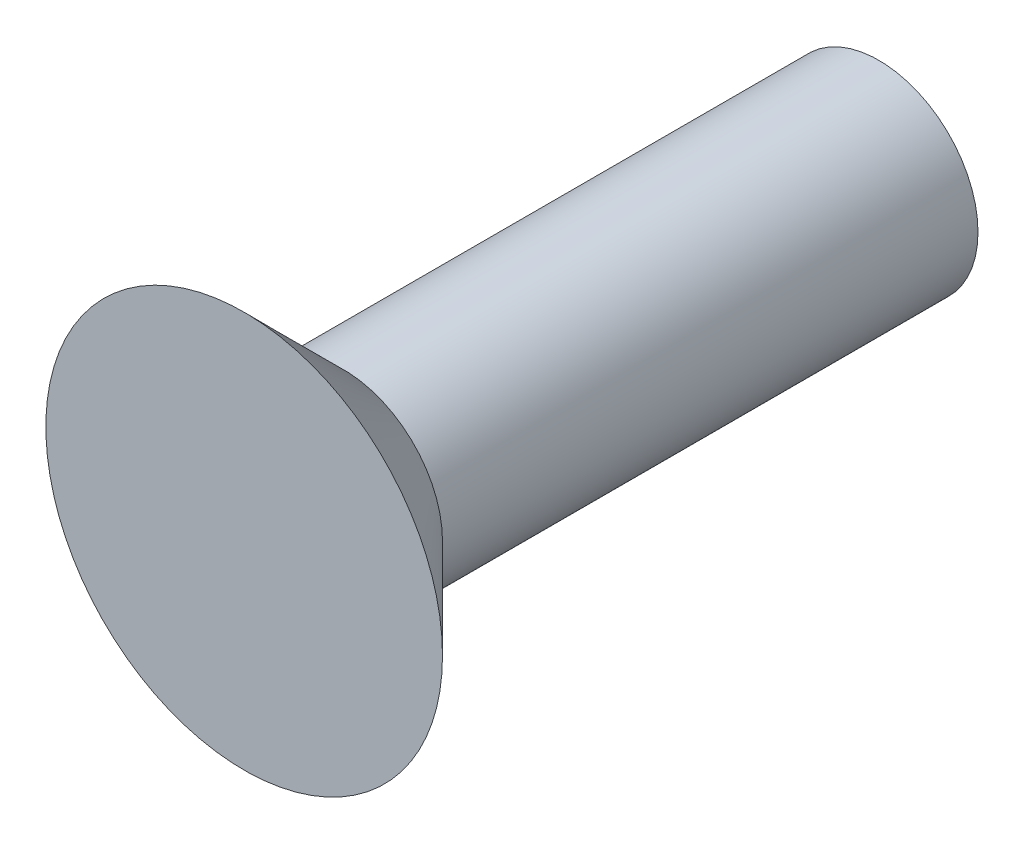
ISO-10303-21;
HEADER;
FILE_DESCRIPTION(('STEP AP214'),'2;1');
FILE_NAME('part.step','',(''),(''),'','','');
FILE_SCHEMA(('AUTOMOTIVE_DESIGN { 1 0 10303 214 1 1 1 1 }'));
ENDSEC;
DATA;
#1=APPLICATION_CONTEXT('core data for automotive mechanical design processes');
#2=APPLICATION_PROTOCOL_DEFINITION('international standard','automotive_design',2000,#1);
#3=PRODUCT_CONTEXT('',#1,'mechanical');
#4=PRODUCT('Part','Part','',(#3));
#5=PRODUCT_RELATED_PRODUCT_CATEGORY('part','',(#4));
#6=PRODUCT_DEFINITION_FORMATION('','',#4);
#7=PRODUCT_DEFINITION_CONTEXT('part definition',#1,'design');
#8=PRODUCT_DEFINITION('design','',#6,#7);
#9=PRODUCT_DEFINITION_SHAPE('','',#8);
#10=(LENGTH_UNIT() NAMED_UNIT(*) SI_UNIT(.MILLI.,.METRE.));
#11=(NAMED_UNIT(*) PLANE_ANGLE_UNIT() SI_UNIT($,.RADIAN.));
#12=(NAMED_UNIT(*) SI_UNIT($,.STERADIAN.) SOLID_ANGLE_UNIT());
#13=UNCERTAINTY_MEASURE_WITH_UNIT(LENGTH_MEASURE(1.E-05),#10,'distance_accuracy_value','');
#14=(GEOMETRIC_REPRESENTATION_CONTEXT(3) GLOBAL_UNCERTAINTY_ASSIGNED_CONTEXT((#13)) GLOBAL_UNIT_ASSIGNED_CONTEXT((#10,
#11,#12)) REPRESENTATION_CONTEXT('',''));
#15=CARTESIAN_POINT('',(0.,0.,0.));
#16=DIRECTION('',(0.,0.,1.));
#17=DIRECTION('',(1.,0.,0.));
#18=AXIS2_PLACEMENT_3D('',#15,#16,#17);
#19=CARTESIAN_POINT('',(0.,0.,0.));
#20=DIRECTION('',(0.,0.,1.));
#21=DIRECTION('',(1.,0.,0.));
#22=AXIS2_PLACEMENT_3D('',#19,#20,#21);
#23=CONICAL_SURFACE('',#22,2.5,0.785398163397448);
#24=CARTESIAN_POINT('',(0.,0.,-1.25));
#25=DIRECTION('',(0.,0.,1.));
#26=DIRECTION('',(1.,0.,0.));
#27=AXIS2_PLACEMENT_3D('',#24,#25,#26);
#28=CIRCLE('',#27,1.25);
#29=CARTESIAN_POINT('',(1.25,0.,-1.25));
#30=VERTEX_POINT('',#29);
#31=EDGE_CURVE('E43',#30,#30,#28,.T.);
#32=ORIENTED_EDGE('',*,*,#31,.T.);
#33=EDGE_LOOP('',(#32));
#34=FACE_BOUND('',#33,.T.);
#35=CARTESIAN_POINT('',(0.,0.,0.));
#36=DIRECTION('',(0.,0.,1.));
#37=DIRECTION('',(1.,0.,0.));
#38=AXIS2_PLACEMENT_3D('',#35,#36,#37);
#39=CIRCLE('',#38,2.5);
#40=CARTESIAN_POINT('',(2.5,0.,0.));
#41=VERTEX_POINT('',#40);
#42=EDGE_CURVE('E10',#41,#41,#39,.T.);
#43=ORIENTED_EDGE('',*,*,#42,.F.);
#44=EDGE_LOOP('',(#43));
#45=FACE_BOUND('',#44,.T.);
#46=ADVANCED_FACE('F40',(#34,#45),#23,.T.);
#47=CARTESIAN_POINT('',(0.,0.,0.));
#48=DIRECTION('',(0.,0.,1.));
#49=DIRECTION('',(1.,0.,0.));
#50=AXIS2_PLACEMENT_3D('',#47,#48,#49);
#51=PLANE('',#50);
#52=ORIENTED_EDGE('',*,*,#42,.T.);
#53=EDGE_LOOP('',(#52));
#54=FACE_BOUND('',#53,.T.);
#55=ADVANCED_FACE('F65',(#54),#51,.T.);
#56=CARTESIAN_POINT('',(0.,0.,-1.25));
#57=DIRECTION('',(0.,0.,-1.));
#58=DIRECTION('',(-1.,0.,0.));
#59=AXIS2_PLACEMENT_3D('',#56,#57,#58);
#60=CYLINDRICAL_SURFACE('',#59,1.25);
#61=ORIENTED_EDGE('',*,*,#31,.F.);
#62=EDGE_LOOP('',(#61));
#63=FACE_BOUND('',#62,.T.);
#64=CARTESIAN_POINT('',(0.,0.,-8.));
#65=DIRECTION('',(0.,0.,1.));
#66=DIRECTION('',(1.,0.,0.));
#67=AXIS2_PLACEMENT_3D('',#64,#65,#66);
#68=CIRCLE('',#67,1.25);
#69=CARTESIAN_POINT('',(1.25,0.,-8.));
#70=VERTEX_POINT('',#69);
#71=EDGE_CURVE('E50',#70,#70,#68,.T.);
#72=ORIENTED_EDGE('',*,*,#71,.T.);
#73=EDGE_LOOP('',(#72));
#74=FACE_BOUND('',#73,.T.);
#75=ADVANCED_FACE('F53',(#63,#74),#60,.T.);
#76=CARTESIAN_POINT('',(0.,0.,-8.));
#77=DIRECTION('',(0.,0.,1.));
#78=DIRECTION('',(1.,0.,0.));
#79=AXIS2_PLACEMENT_3D('',#76,#77,#78);
#80=PLANE('',#79);
#81=ORIENTED_EDGE('',*,*,#71,.F.);
#82=EDGE_LOOP('',(#81));
#83=FACE_BOUND('',#82,.T.);
#84=ADVANCED_FACE('F57',(#83),#80,.F.);
#85=CLOSED_SHELL('',(#46,#55,#75,#84));
#86=MANIFOLD_SOLID_BREP('B2',#85);
#87=ADVANCED_BREP_SHAPE_REPRESENTATION('',(#18,#86),#14);
#88=SHAPE_DEFINITION_REPRESENTATION(#9,#87);
ENDSEC;
END-ISO-10303-21;
